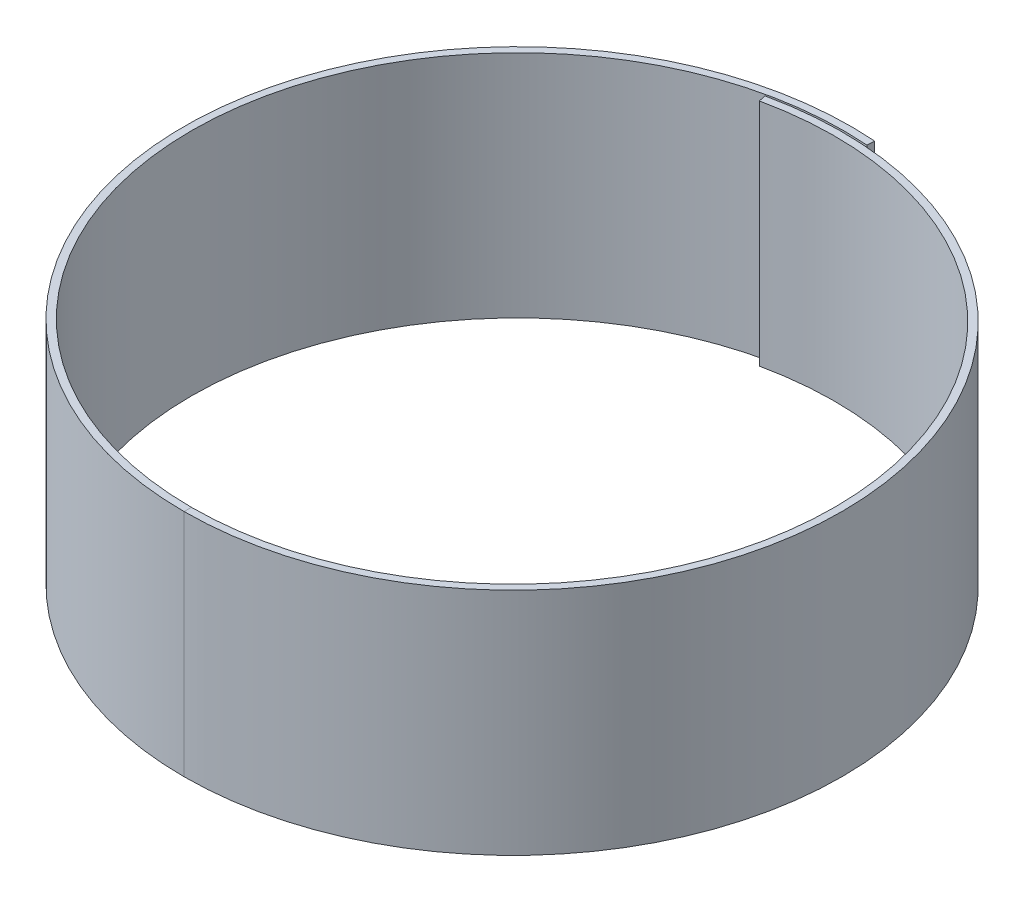
ISO-10303-21;
HEADER;
FILE_DESCRIPTION(('STEP AP214'),'2;1');
FILE_NAME('part.step','',(''),(''),'','','');
FILE_SCHEMA(('AUTOMOTIVE_DESIGN { 1 0 10303 214 1 1 1 1 }'));
ENDSEC;
DATA;
#1=APPLICATION_CONTEXT('core data for automotive mechanical design processes');
#2=APPLICATION_PROTOCOL_DEFINITION('international standard','automotive_design',2000,#1);
#3=PRODUCT_CONTEXT('',#1,'mechanical');
#4=PRODUCT('Part','Part','',(#3));
#5=PRODUCT_RELATED_PRODUCT_CATEGORY('part','',(#4));
#6=PRODUCT_DEFINITION_FORMATION('','',#4);
#7=PRODUCT_DEFINITION_CONTEXT('part definition',#1,'design');
#8=PRODUCT_DEFINITION('design','',#6,#7);
#9=PRODUCT_DEFINITION_SHAPE('','',#8);
#10=(LENGTH_UNIT() NAMED_UNIT(*) SI_UNIT(.MILLI.,.METRE.));
#11=(NAMED_UNIT(*) PLANE_ANGLE_UNIT() SI_UNIT($,.RADIAN.));
#12=(NAMED_UNIT(*) SI_UNIT($,.STERADIAN.) SOLID_ANGLE_UNIT());
#13=UNCERTAINTY_MEASURE_WITH_UNIT(LENGTH_MEASURE(1.E-05),#10,'distance_accuracy_value','');
#14=(GEOMETRIC_REPRESENTATION_CONTEXT(3) GLOBAL_UNCERTAINTY_ASSIGNED_CONTEXT((#13)) GLOBAL_UNIT_ASSIGNED_CONTEXT((#10,
#11,#12)) REPRESENTATION_CONTEXT('',''));
#15=CARTESIAN_POINT('',(0.,0.,0.));
#16=DIRECTION('',(0.,0.,1.));
#17=DIRECTION('',(1.,0.,0.));
#18=AXIS2_PLACEMENT_3D('',#15,#16,#17);
#19=CARTESIAN_POINT('',(0.,25.,36.3000000000001));
#20=DIRECTION('',(0.,1.,0.));
#21=DIRECTION('',(0.,0.,1.));
#22=AXIS2_PLACEMENT_3D('',#19,#20,#21);
#23=PLANE('',#22);
#24=DIRECTION('',(0.,0.,-1.));
#25=VECTOR('',#24,1.);
#26=CARTESIAN_POINT('',(0.,25.,36.3000000000001));
#27=LINE('',#26,#25);
#28=CARTESIAN_POINT('',(0.,25.,36.3000000000001));
#29=VERTEX_POINT('',#28);
#30=CARTESIAN_POINT('',(0.,25.,35.5000000000001));
#31=VERTEX_POINT('',#30);
#32=EDGE_CURVE('E11',#29,#31,#27,.T.);
#33=ORIENTED_EDGE('',*,*,#32,.F.);
#34=CARTESIAN_POINT('',(0.,25.,0.5));
#35=DIRECTION('',(0.,1.,0.));
#36=DIRECTION('',(1.,0.,0.));
#37=AXIS2_PLACEMENT_3D('',#34,#35,#36);
#38=CIRCLE('',#37,35.8000000000001);
#39=CARTESIAN_POINT('',(-7.56324371174229,25.,-34.4919611419079));
#40=VERTEX_POINT('',#39);
#41=EDGE_CURVE('E86',#29,#40,#38,.T.);
#42=ORIENTED_EDGE('',*,*,#41,.T.);
#43=DIRECTION('',(-0.211263790830791,0.,-0.977429082176198));
#44=VECTOR('',#43,1.);
#45=CARTESIAN_POINT('',(-7.39423267907766,25.,-33.710017876167));
#46=LINE('',#45,#44);
#47=CARTESIAN_POINT('',(-7.39423267907766,25.,-33.710017876167));
#48=VERTEX_POINT('',#47);
#49=EDGE_CURVE('E147',#48,#40,#46,.T.);
#50=ORIENTED_EDGE('',*,*,#49,.F.);
#51=CARTESIAN_POINT('',(0.,25.,0.5));
#52=DIRECTION('',(0.,1.,0.));
#53=DIRECTION('',(0.,0.,1.));
#54=AXIS2_PLACEMENT_3D('',#51,#52,#53);
#55=CIRCLE('',#54,35.0000000000001);
#56=EDGE_CURVE('E113',#31,#48,#55,.T.);
#57=ORIENTED_EDGE('',*,*,#56,.F.);
#58=EDGE_LOOP('',(#33,#42,#50,#57));
#59=FACE_BOUND('',#58,.T.);
#60=ADVANCED_FACE('F39',(#59),#23,.T.);
#61=CARTESIAN_POINT('',(0.,0.,35.5000000000001));
#62=DIRECTION('',(0.,-1.,0.));
#63=DIRECTION('',(0.,0.,-1.));
#64=AXIS2_PLACEMENT_3D('',#61,#62,#63);
#65=PLANE('',#64);
#66=DIRECTION('',(0.,0.,1.));
#67=VECTOR('',#66,1.);
#68=CARTESIAN_POINT('',(0.,0.,35.5000000000001));
#69=LINE('',#68,#67);
#70=CARTESIAN_POINT('',(0.,0.,35.5000000000001));
#71=VERTEX_POINT('',#70);
#72=CARTESIAN_POINT('',(0.,0.,36.3000000000001));
#73=VERTEX_POINT('',#72);
#74=EDGE_CURVE('E47',#71,#73,#69,.T.);
#75=ORIENTED_EDGE('',*,*,#74,.F.);
#76=CARTESIAN_POINT('',(0.,0.,0.5));
#77=DIRECTION('',(0.,1.,0.));
#78=DIRECTION('',(0.,0.,1.));
#79=AXIS2_PLACEMENT_3D('',#76,#77,#78);
#80=CIRCLE('',#79,35.0000000000001);
#81=CARTESIAN_POINT('',(-7.39423267907766,0.,-33.710017876167));
#82=VERTEX_POINT('',#81);
#83=EDGE_CURVE('E128',#71,#82,#80,.T.);
#84=ORIENTED_EDGE('',*,*,#83,.T.);
#85=DIRECTION('',(-0.211263790830791,0.,-0.977429082176198));
#86=VECTOR('',#85,1.);
#87=CARTESIAN_POINT('',(-7.39423267907766,0.,-33.710017876167));
#88=LINE('',#87,#86);
#89=CARTESIAN_POINT('',(-7.56324371174229,0.,-34.4919611419079));
#90=VERTEX_POINT('',#89);
#91=EDGE_CURVE('E125',#82,#90,#88,.T.);
#92=ORIENTED_EDGE('',*,*,#91,.T.);
#93=CARTESIAN_POINT('',(0.,0.,0.5));
#94=DIRECTION('',(0.,1.,0.));
#95=DIRECTION('',(1.,0.,0.));
#96=AXIS2_PLACEMENT_3D('',#93,#94,#95);
#97=CIRCLE('',#96,35.8000000000001);
#98=EDGE_CURVE('E122',#73,#90,#97,.T.);
#99=ORIENTED_EDGE('',*,*,#98,.F.);
#100=EDGE_LOOP('',(#75,#84,#92,#99));
#101=FACE_BOUND('',#100,.T.);
#102=ADVANCED_FACE('F153',(#101),#65,.T.);
#103=CARTESIAN_POINT('',(0.,25.,0.5));
#104=DIRECTION('',(0.,-1.,0.));
#105=DIRECTION('',(0.,0.,-1.));
#106=AXIS2_PLACEMENT_3D('',#103,#104,#105);
#107=CYLINDRICAL_SURFACE('',#106,35.8000000000001);
#108=ORIENTED_EDGE('',*,*,#98,.T.);
#109=DIRECTION('',(0.,-1.,0.));
#110=VECTOR('',#109,1.);
#111=CARTESIAN_POINT('',(-7.56324371174229,25.,-34.4919611419079));
#112=LINE('',#111,#110);
#113=EDGE_CURVE('E142',#40,#90,#112,.T.);
#114=ORIENTED_EDGE('',*,*,#113,.F.);
#115=ORIENTED_EDGE('',*,*,#41,.F.);
#116=DIRECTION('',(0.,-1.,0.));
#117=VECTOR('',#116,1.);
#118=CARTESIAN_POINT('',(0.,25.,36.3000000000001));
#119=LINE('',#118,#117);
#120=EDGE_CURVE('E118',#29,#73,#119,.T.);
#121=ORIENTED_EDGE('',*,*,#120,.T.);
#122=EDGE_LOOP('',(#108,#114,#115,#121));
#123=FACE_BOUND('',#122,.T.);
#124=ADVANCED_FACE('F150',(#123),#107,.T.);
#125=CARTESIAN_POINT('',(-7.39423267907766,25.,-33.710017876167));
#126=DIRECTION('',(-0.977429082176197,0.,0.211263790830791));
#127=DIRECTION('',(0.211263790830791,0.,0.977429082176198));
#128=AXIS2_PLACEMENT_3D('',#125,#126,#127);
#129=PLANE('',#128);
#130=ORIENTED_EDGE('',*,*,#91,.F.);
#131=DIRECTION('',(0.,-1.,0.));
#132=VECTOR('',#131,1.);
#133=CARTESIAN_POINT('',(-7.39423267907766,25.,-33.710017876167));
#134=LINE('',#133,#132);
#135=EDGE_CURVE('E140',#48,#82,#134,.T.);
#136=ORIENTED_EDGE('',*,*,#135,.F.);
#137=ORIENTED_EDGE('',*,*,#49,.T.);
#138=ORIENTED_EDGE('',*,*,#113,.T.);
#139=EDGE_LOOP('',(#130,#136,#137,#138));
#140=FACE_BOUND('',#139,.T.);
#141=ADVANCED_FACE('F146',(#140),#129,.T.);
#142=CARTESIAN_POINT('',(0.,25.,0.5));
#143=DIRECTION('',(0.,-1.,0.));
#144=DIRECTION('',(0.,0.,-1.));
#145=AXIS2_PLACEMENT_3D('',#142,#143,#144);
#146=CYLINDRICAL_SURFACE('',#145,35.0000000000001);
#147=ORIENTED_EDGE('',*,*,#83,.F.);
#148=DIRECTION('',(0.,-1.,0.));
#149=VECTOR('',#148,1.);
#150=CARTESIAN_POINT('',(0.,25.,35.5000000000001));
#151=LINE('',#150,#149);
#152=EDGE_CURVE('E106',#31,#71,#151,.T.);
#153=ORIENTED_EDGE('',*,*,#152,.F.);
#154=ORIENTED_EDGE('',*,*,#56,.T.);
#155=ORIENTED_EDGE('',*,*,#135,.T.);
#156=EDGE_LOOP('',(#147,#153,#154,#155));
#157=FACE_BOUND('',#156,.T.);
#158=ADVANCED_FACE('F156',(#157),#146,.F.);
#159=CARTESIAN_POINT('',(0.,25.,0.));
#160=DIRECTION('',(0.,-1.,0.));
#161=DIRECTION('',(0.,0.,-1.));
#162=AXIS2_PLACEMENT_3D('',#159,#160,#161);
#163=CYLINDRICAL_SURFACE('',#162,35.5000000000001);
#164=CARTESIAN_POINT('',(0.,0.,0.));
#165=DIRECTION('',(0.,1.,0.));
#166=DIRECTION('',(0.,0.,1.));
#167=AXIS2_PLACEMENT_3D('',#164,#165,#166);
#168=CIRCLE('',#167,35.5000000000001);
#169=CARTESIAN_POINT('',(2.60576732092235,0.,-35.4042367050784));
#170=VERTEX_POINT('',#169);
#171=EDGE_CURVE('E101',#170,#71,#168,.T.);
#172=ORIENTED_EDGE('',*,*,#171,.F.);
#173=DIRECTION('',(0.,-1.,0.));
#174=VECTOR('',#173,1.);
#175=CARTESIAN_POINT('',(2.60576732092235,25.,-35.4042367050784));
#176=LINE('',#175,#174);
#177=CARTESIAN_POINT('',(2.60576732092235,25.,-35.4042367050784));
#178=VERTEX_POINT('',#177);
#179=EDGE_CURVE('E96',#178,#170,#176,.T.);
#180=ORIENTED_EDGE('',*,*,#179,.F.);
#181=CARTESIAN_POINT('',(0.,25.,0.));
#182=DIRECTION('',(0.,1.,0.));
#183=DIRECTION('',(0.,0.,1.));
#184=AXIS2_PLACEMENT_3D('',#181,#182,#183);
#185=CIRCLE('',#184,35.5000000000001);
#186=EDGE_CURVE('E100',#178,#31,#185,.T.);
#187=ORIENTED_EDGE('',*,*,#186,.T.);
#188=ORIENTED_EDGE('',*,*,#152,.T.);
#189=EDGE_LOOP('',(#172,#180,#187,#188));
#190=FACE_BOUND('',#189,.T.);
#191=ADVANCED_FACE('F98',(#190),#163,.F.);
#192=CARTESIAN_POINT('',(2.66448883801355,25.,-36.2020786589956));
#193=DIRECTION('',(0.997302442396572,0.,0.073401896364007));
#194=DIRECTION('',(0.073401896364007,0.,-0.997302442396572));
#195=AXIS2_PLACEMENT_3D('',#192,#193,#194);
#196=PLANE('',#195);
#197=DIRECTION('',(-0.073401896364007,0.,0.997302442396572));
#198=VECTOR('',#197,1.);
#199=CARTESIAN_POINT('',(2.66448883801355,0.,-36.2020786589956));
#200=LINE('',#199,#198);
#201=CARTESIAN_POINT('',(2.66448883801355,0.,-36.2020786589956));
#202=VERTEX_POINT('',#201);
#203=EDGE_CURVE('E132',#202,#170,#200,.T.);
#204=ORIENTED_EDGE('',*,*,#203,.F.);
#205=DIRECTION('',(0.,-1.,0.));
#206=VECTOR('',#205,1.);
#207=CARTESIAN_POINT('',(2.66448883801355,25.,-36.2020786589956));
#208=LINE('',#207,#206);
#209=CARTESIAN_POINT('',(2.66448883801355,25.,-36.2020786589956));
#210=VERTEX_POINT('',#209);
#211=EDGE_CURVE('E76',#210,#202,#208,.T.);
#212=ORIENTED_EDGE('',*,*,#211,.F.);
#213=DIRECTION('',(-0.073401896364007,0.,0.997302442396572));
#214=VECTOR('',#213,1.);
#215=CARTESIAN_POINT('',(2.66448883801355,25.,-36.2020786589956));
#216=LINE('',#215,#214);
#217=EDGE_CURVE('E111',#210,#178,#216,.T.);
#218=ORIENTED_EDGE('',*,*,#217,.T.);
#219=ORIENTED_EDGE('',*,*,#179,.T.);
#220=EDGE_LOOP('',(#204,#212,#218,#219));
#221=FACE_BOUND('',#220,.T.);
#222=ADVANCED_FACE('F115',(#221),#196,.T.);
#223=CARTESIAN_POINT('',(0.,25.,0.));
#224=DIRECTION('',(0.,-1.,0.));
#225=DIRECTION('',(0.,0.,-1.));
#226=AXIS2_PLACEMENT_3D('',#223,#224,#225);
#227=CYLINDRICAL_SURFACE('',#226,36.3000000000001);
#228=CARTESIAN_POINT('',(0.,0.,0.));
#229=DIRECTION('',(0.,1.,0.));
#230=DIRECTION('',(1.,0.,0.));
#231=AXIS2_PLACEMENT_3D('',#228,#229,#230);
#232=CIRCLE('',#231,36.3000000000001);
#233=EDGE_CURVE('E134',#202,#73,#232,.T.);
#234=ORIENTED_EDGE('',*,*,#233,.T.);
#235=ORIENTED_EDGE('',*,*,#120,.F.);
#236=CARTESIAN_POINT('',(0.,25.,0.));
#237=DIRECTION('',(0.,1.,0.));
#238=DIRECTION('',(1.,0.,0.));
#239=AXIS2_PLACEMENT_3D('',#236,#237,#238);
#240=CIRCLE('',#239,36.3000000000001);
#241=EDGE_CURVE('E116',#210,#29,#240,.T.);
#242=ORIENTED_EDGE('',*,*,#241,.F.);
#243=ORIENTED_EDGE('',*,*,#211,.T.);
#244=EDGE_LOOP('',(#234,#235,#242,#243));
#245=FACE_BOUND('',#244,.T.);
#246=ADVANCED_FACE('F159',(#245),#227,.T.);
#247=CARTESIAN_POINT('',(0.,25.,0.5));
#248=DIRECTION('',(0.,1.,0.));
#249=DIRECTION('',(1.,0.,0.));
#250=AXIS2_PLACEMENT_3D('',#247,#248,#249);
#251=PLANE('',#250);
#252=ORIENTED_EDGE('',*,*,#241,.T.);
#253=ORIENTED_EDGE('',*,*,#32,.T.);
#254=ORIENTED_EDGE('',*,*,#186,.F.);
#255=ORIENTED_EDGE('',*,*,#217,.F.);
#256=EDGE_LOOP('',(#252,#253,#254,#255));
#257=FACE_BOUND('',#256,.T.);
#258=ADVANCED_FACE('F110',(#257),#251,.T.);
#259=CARTESIAN_POINT('',(0.,0.,0.5));
#260=DIRECTION('',(0.,1.,0.));
#261=DIRECTION('',(1.,0.,0.));
#262=AXIS2_PLACEMENT_3D('',#259,#260,#261);
#263=PLANE('',#262);
#264=ORIENTED_EDGE('',*,*,#171,.T.);
#265=ORIENTED_EDGE('',*,*,#74,.T.);
#266=ORIENTED_EDGE('',*,*,#233,.F.);
#267=ORIENTED_EDGE('',*,*,#203,.T.);
#268=EDGE_LOOP('',(#264,#265,#266,#267));
#269=FACE_BOUND('',#268,.T.);
#270=ADVANCED_FACE('F158',(#269),#263,.F.);
#271=CLOSED_SHELL('',(#60,#102,#124,#141,#158,#191,#222,#246,#258,#270));
#272=MANIFOLD_SOLID_BREP('B2',#271);
#273=ADVANCED_BREP_SHAPE_REPRESENTATION('',(#18,#272),#14);
#274=SHAPE_DEFINITION_REPRESENTATION(#9,#273);
ENDSEC;
END-ISO-10303-21;
